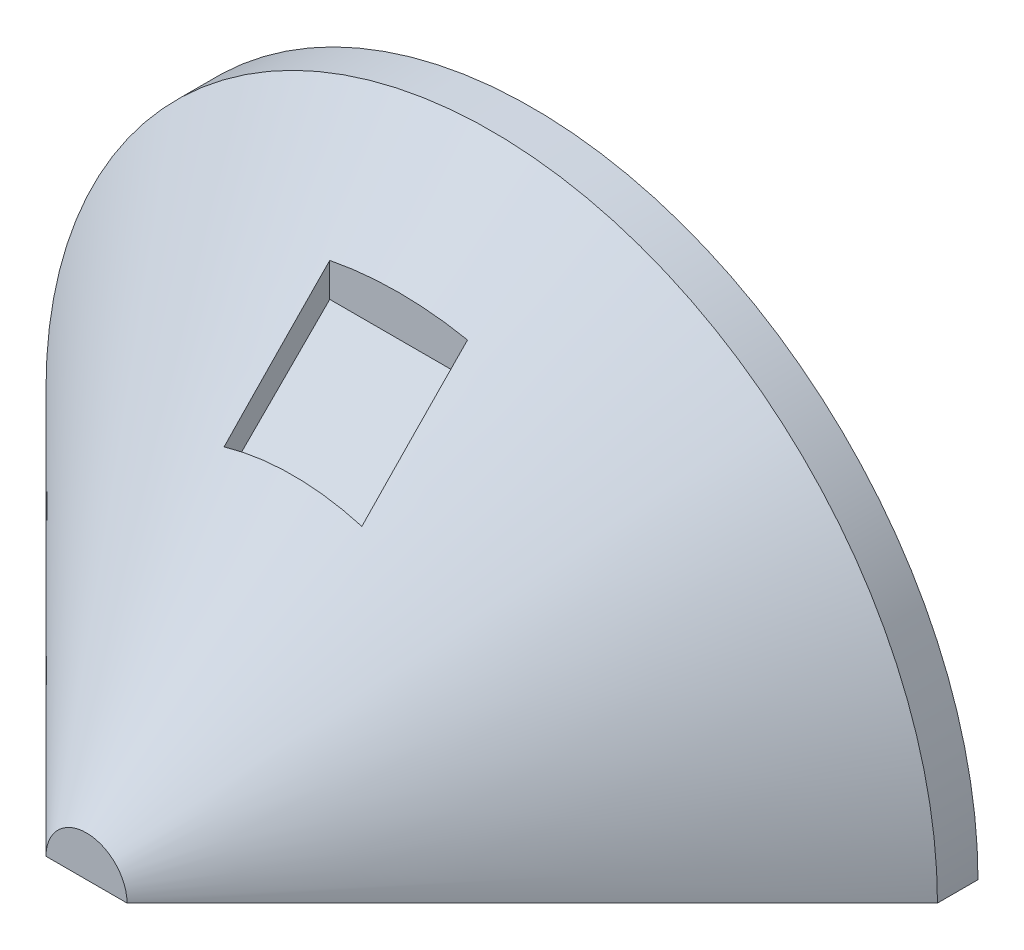
ISO-10303-21;
HEADER;
FILE_DESCRIPTION(('STEP AP214'),'2;1');
FILE_NAME('part.step','',(''),(''),'','','');
FILE_SCHEMA(('AUTOMOTIVE_DESIGN { 1 0 10303 214 1 1 1 1 }'));
ENDSEC;
DATA;
#1=APPLICATION_CONTEXT('core data for automotive mechanical design processes');
#2=APPLICATION_PROTOCOL_DEFINITION('international standard','automotive_design',2000,#1);
#3=PRODUCT_CONTEXT('',#1,'mechanical');
#4=PRODUCT('Part','Part','',(#3));
#5=PRODUCT_RELATED_PRODUCT_CATEGORY('part','',(#4));
#6=PRODUCT_DEFINITION_FORMATION('','',#4);
#7=PRODUCT_DEFINITION_CONTEXT('part definition',#1,'design');
#8=PRODUCT_DEFINITION('design','',#6,#7);
#9=PRODUCT_DEFINITION_SHAPE('','',#8);
#10=(LENGTH_UNIT() NAMED_UNIT(*) SI_UNIT(.MILLI.,.METRE.));
#11=(NAMED_UNIT(*) PLANE_ANGLE_UNIT() SI_UNIT($,.RADIAN.));
#12=(NAMED_UNIT(*) SI_UNIT($,.STERADIAN.) SOLID_ANGLE_UNIT());
#13=UNCERTAINTY_MEASURE_WITH_UNIT(LENGTH_MEASURE(1.E-05),#10,'distance_accuracy_value','');
#14=(GEOMETRIC_REPRESENTATION_CONTEXT(3) GLOBAL_UNCERTAINTY_ASSIGNED_CONTEXT((#13)) GLOBAL_UNIT_ASSIGNED_CONTEXT((#10,
#11,#12)) REPRESENTATION_CONTEXT('',''));
#15=CARTESIAN_POINT('',(0.,0.,0.));
#16=DIRECTION('',(0.,0.,1.));
#17=DIRECTION('',(1.,0.,0.));
#18=AXIS2_PLACEMENT_3D('',#15,#16,#17);
#19=CARTESIAN_POINT('',(0.,0.,0.));
#20=DIRECTION('',(0.,0.,1.));
#21=DIRECTION('',(1.,0.,0.));
#22=AXIS2_PLACEMENT_3D('',#19,#20,#21);
#23=PLANE('',#22);
#24=CARTESIAN_POINT('',(0.,0.,0.));
#25=DIRECTION('',(0.,0.,-1.));
#26=DIRECTION('',(-1.,0.,0.));
#27=AXIS2_PLACEMENT_3D('',#24,#25,#26);
#28=CIRCLE('',#27,3.81);
#29=CARTESIAN_POINT('',(-3.81,0.,0.));
#30=VERTEX_POINT('',#29);
#31=CARTESIAN_POINT('',(3.81,0.,0.));
#32=VERTEX_POINT('',#31);
#33=EDGE_CURVE('E70',#30,#32,#28,.T.);
#34=ORIENTED_EDGE('',*,*,#33,.F.);
#35=DIRECTION('',(1.,0.,0.));
#36=VECTOR('',#35,1.);
#37=CARTESIAN_POINT('',(0.,0.,0.));
#38=LINE('',#37,#36);
#39=EDGE_CURVE('E183',#30,#32,#38,.T.);
#40=ORIENTED_EDGE('',*,*,#39,.T.);
#41=EDGE_LOOP('',(#34,#40));
#42=FACE_BOUND('',#41,.T.);
#43=ADVANCED_FACE('F43',(#42),#23,.T.);
#44=CARTESIAN_POINT('',(0.,0.,-38.1));
#45=DIRECTION('',(0.,0.,-1.));
#46=DIRECTION('',(-1.,0.,0.));
#47=AXIS2_PLACEMENT_3D('',#44,#45,#46);
#48=CONICAL_SURFACE('',#47,41.91,0.785398163397448);
#49=CARTESIAN_POINT('',(6.477,-0.112424499922271,-2.66797563040976));
#50=CARTESIAN_POINT('',(6.477,-0.0315397783691941,-2.66656842659704));
#51=CARTESIAN_POINT('',(6.477,0.0493638171931178,-2.66668282075297));
#52=CARTESIAN_POINT('',(6.477,0.211105285739149,-2.66993557111974));
#53=CARTESIAN_POINT('',(6.477,0.291943162485806,-2.67307373989165));
#54=CARTESIAN_POINT('',(6.477,0.534021317714192,-2.68698377775918));
#55=CARTESIAN_POINT('',(6.477,0.695023658826708,-2.70224785264693));
#56=CARTESIAN_POINT('',(6.477,1.01277699998929,-2.74384155982011));
#57=CARTESIAN_POINT('',(6.477,1.16955373923047,-2.7699786290904));
#58=CARTESIAN_POINT('',(6.477,1.48109428375716,-2.83242852403535));
#59=CARTESIAN_POINT('',(6.477,1.63585744062297,-2.86874454665507));
#60=CARTESIAN_POINT('',(6.477,2.0743987666114,-2.98553121341364));
#61=CARTESIAN_POINT('',(6.477,2.35521836151851,-3.07718883395554));
#62=CARTESIAN_POINT('',(6.477,2.9076359645997,-3.28507676071129));
#63=CARTESIAN_POINT('',(6.477,3.17922539734786,-3.40132922986404));
#64=CARTESIAN_POINT('',(6.477,3.58156012766853,-3.59033228058236));
#65=CARTESIAN_POINT('',(6.477,3.71560732791135,-3.65620440562166));
#66=CARTESIAN_POINT('',(6.477,3.98159947791186,-3.79207713575769));
#67=CARTESIAN_POINT('',(6.477,4.11354439397102,-3.86207780694848));
#68=CARTESIAN_POINT('',(6.477,4.37541161385664,-4.00561053251651));
#69=CARTESIAN_POINT('',(6.477,4.50533482836017,-4.07914093214022));
#70=CARTESIAN_POINT('',(6.477,4.7633697993553,-4.22929280967487));
#71=CARTESIAN_POINT('',(6.477,4.89148163532004,-4.30591415140071));
#72=CARTESIAN_POINT('',(6.477,5.30848315030634,-4.56131561145365));
#73=CARTESIAN_POINT('',(6.477,5.59394527853482,-4.74570209717957));
#74=CARTESIAN_POINT('',(6.477,6.15801622443841,-5.12471571332597));
#75=CARTESIAN_POINT('',(6.477,6.43662328771391,-5.31934542607513));
#76=CARTESIAN_POINT('',(6.477,6.98850666908645,-5.7164909358629));
#77=CARTESIAN_POINT('',(6.477,7.26177814593219,-5.91901343690778));
#78=CARTESIAN_POINT('',(6.477,7.80377309754577,-6.3299812599359));
#79=CARTESIAN_POINT('',(6.477,8.07249698312132,-6.53842604232193));
#80=CARTESIAN_POINT('',(6.477,8.6070222328027,-6.96058144259871));
#81=CARTESIAN_POINT('',(6.477,8.87281297877217,-7.17430547202932));
#82=CARTESIAN_POINT('',(6.477,9.40134550956858,-7.60549328726715));
#83=CARTESIAN_POINT('',(6.477,9.66408723681773,-7.82295714350557));
#84=CARTESIAN_POINT('',(6.477,10.1869085577479,-8.26080099769757));
#85=CARTESIAN_POINT('',(6.477,10.4469893836969,-8.48117952635406));
#86=CARTESIAN_POINT('',(6.477,10.9650282174673,-8.92441964236062));
#87=CARTESIAN_POINT('',(6.477,11.2229862031139,-9.14728125559146));
#88=CARTESIAN_POINT('',(6.477,11.9959394192831,-9.82046305935856));
#89=CARTESIAN_POINT('',(6.477,12.5082363060682,-10.2738812395394));
#90=CARTESIAN_POINT('',(6.477,13.5276550554752,-11.1865890975303));
#91=CARTESIAN_POINT('',(6.477,14.0347763404682,-11.6458794180955));
#92=CARTESIAN_POINT('',(6.477,15.0441690034447,-12.5679261684386));
#93=CARTESIAN_POINT('',(6.477,15.5464475056236,-13.0306748075445));
#94=CARTESIAN_POINT('',(6.477,16.5479678081906,-13.9594047983083));
#95=CARTESIAN_POINT('',(6.477,17.0472097215484,-14.425386028307));
#96=CARTESIAN_POINT('',(6.477,18.2937231159675,-15.5947515567936));
#97=CARTESIAN_POINT('',(6.477,19.0395112530478,-16.2997163027392));
#98=CARTESIAN_POINT('',(6.477,20.5272829862537,-17.7136515933826));
#99=CARTESIAN_POINT('',(6.477,21.2692665589997,-18.4226221626405));
#100=CARTESIAN_POINT('',(6.477,22.7504248916093,-19.8435342618056));
#101=CARTESIAN_POINT('',(6.477,23.4895995660363,-20.5554758807211));
#102=CARTESIAN_POINT('',(6.477,24.9657941301942,-21.9815903637915));
#103=CARTESIAN_POINT('',(6.477,25.7028140168265,-22.695763231152));
#104=CARTESIAN_POINT('',(6.477,27.1757973057999,-24.1264414578815));
#105=CARTESIAN_POINT('',(6.477,27.9117592880827,-24.842948278796));
#106=CARTESIAN_POINT('',(6.477,29.3823462026258,-26.2773329597243));
#107=CARTESIAN_POINT('',(6.477,30.116971134271,-26.9952108203684));
#108=CARTESIAN_POINT('',(6.477,32.3192203678154,-29.1504601094189));
#109=CARTESIAN_POINT('',(6.477,33.7852417498964,-30.589469271821));
#110=CARTESIAN_POINT('',(6.477,36.6734260487644,-33.4301140399115));
#111=CARTESIAN_POINT('',(6.477,38.0956684775221,-34.8316688664826));
#112=CARTESIAN_POINT('',(6.477,40.9381992558085,-37.6367720278648));
#113=CARTESIAN_POINT('',(6.477,42.3584875959085,-39.040320372229));
#114=CARTESIAN_POINT('',(6.477,45.1962800034836,-41.8475518515579));
#115=CARTESIAN_POINT('',(6.477,46.6137854336088,-43.251233609422));
#116=CARTESIAN_POINT('',(6.477,49.4476698513075,-46.0597176261795));
#117=CARTESIAN_POINT('',(6.477,50.8640488452802,-47.4645198786154));
#118=CARTESIAN_POINT('',(6.477,52.2800304745773,-48.8697220514946));
#119=B_SPLINE_CURVE_WITH_KNOTS('',3,(#49,#50,#51,#52,#53,#54,#55,#56,#57,#58,#59,#60,#61,#62,
#63,#64,#65,#66,#67,#68,#69,#70,#71,#72,#73,#74,#75,#76,#77,#78,#79,#80,#81,#82,#83,#84,#85,#86,
#87,#88,#89,#90,#91,#92,#93,#94,#95,#96,#97,#98,#99,#100,#101,#102,#103,#104,#105,#106,#107,
#108,#109,#110,#111,#112,#113,#114,#115,#116,#117,#118),.UNSPECIFIED.,.F.,.F.,(4,2,2,2,2,2,2,2,
2,2,2,2,2,2,2,2,2,2,2,2,2,2,2,2,2,2,2,2,2,2,2,2,2,2,4),(0.,0.242661787159103,0.48530853307144,
0.970010831047795,1.44647163259076,1.92308224611174,2.80765362181052,3.6930255247552,
4.14104106147632,4.58906377244409,5.03687846124224,5.48467344108918,6.50383180494214,
7.52324834207755,8.54355047879481,9.56375994890728,10.5869013146027,11.6100619700024,
12.6327251442111,13.6553989874515,15.7077215114594,17.7602706361088,19.8090997120878,
21.8578520938967,24.9365585845551,28.0152839715619,31.0941022644535,34.1729249826392,
37.2543507480666,40.3357779305724,46.4985375309629,52.4888746624677,58.479240597486,
64.4639535509897,70.4486322598744),.UNSPECIFIED.);
#120=CARTESIAN_POINT('',(6.477,22.3014309146922,-19.4129487757862));
#121=VERTEX_POINT('',#120);
#122=CARTESIAN_POINT('',(6.477,32.5155241960894,-29.3443487757862));
#123=VERTEX_POINT('',#122);
#124=EDGE_CURVE('E11',#121,#123,#119,.T.);
#125=ORIENTED_EDGE('',*,*,#124,.F.);
#126=CARTESIAN_POINT('',(0.,0.,-19.4129487757862));
#127=DIRECTION('',(0.,0.,-1.));
#128=DIRECTION('',(0.,1.,0.));
#129=AXIS2_PLACEMENT_3D('',#126,#127,#128);
#130=CIRCLE('',#129,23.2229487757862);
#131=CARTESIAN_POINT('',(-6.477,22.3014309146922,-19.4129487757862));
#132=VERTEX_POINT('',#131);
#133=EDGE_CURVE('E205',#121,#132,#130,.F.);
#134=ORIENTED_EDGE('',*,*,#133,.T.);
#135=CARTESIAN_POINT('',(-6.477,-0.112424499922271,-2.66797563040976));
#136=CARTESIAN_POINT('',(-6.477,-0.0315397783691942,-2.66656842659705));
#137=CARTESIAN_POINT('',(-6.477,0.0493638171931179,-2.66668282075297));
#138=CARTESIAN_POINT('',(-6.477,0.211105285739149,-2.66993557111974));
#139=CARTESIAN_POINT('',(-6.477,0.291943162485806,-2.67307373989164));
#140=CARTESIAN_POINT('',(-6.477,0.534021317714192,-2.68698377775917));
#141=CARTESIAN_POINT('',(-6.477,0.695023658826709,-2.70224785264693));
#142=CARTESIAN_POINT('',(-6.477,1.01277699998929,-2.74384155982011));
#143=CARTESIAN_POINT('',(-6.477,1.16955373923047,-2.76997862909041));
#144=CARTESIAN_POINT('',(-6.477,1.48109428375716,-2.83242852403536));
#145=CARTESIAN_POINT('',(-6.477,1.63585744062297,-2.86874454665508));
#146=CARTESIAN_POINT('',(-6.477,2.0743987666114,-2.98553121341365));
#147=CARTESIAN_POINT('',(-6.477,2.35521836151851,-3.07718883395553));
#148=CARTESIAN_POINT('',(-6.477,2.9076359645997,-3.28507676071129));
#149=CARTESIAN_POINT('',(-6.477,3.17922539734786,-3.40132922986405));
#150=CARTESIAN_POINT('',(-6.477,3.58156012766853,-3.59033228058236));
#151=CARTESIAN_POINT('',(-6.477,3.71560732791135,-3.65620440562166));
#152=CARTESIAN_POINT('',(-6.477,3.98159947791186,-3.79207713575769));
#153=CARTESIAN_POINT('',(-6.477,4.11354439397102,-3.86207780694848));
#154=CARTESIAN_POINT('',(-6.477,4.37541161385664,-4.00561053251651));
#155=CARTESIAN_POINT('',(-6.477,4.50533482836017,-4.07914093214022));
#156=CARTESIAN_POINT('',(-6.477,4.7633697993553,-4.22929280967487));
#157=CARTESIAN_POINT('',(-6.477,4.89148163532004,-4.30591415140071));
#158=CARTESIAN_POINT('',(-6.477,5.30848315030634,-4.56131561145365));
#159=CARTESIAN_POINT('',(-6.477,5.59394527853482,-4.74570209717957));
#160=CARTESIAN_POINT('',(-6.477,6.15801622443841,-5.12471571332596));
#161=CARTESIAN_POINT('',(-6.477,6.43662328771391,-5.31934542607514));
#162=CARTESIAN_POINT('',(-6.477,6.98850666908645,-5.71649093586291));
#163=CARTESIAN_POINT('',(-6.477,7.26177814593219,-5.91901343690779));
#164=CARTESIAN_POINT('',(-6.477,7.80377309754577,-6.3299812599359));
#165=CARTESIAN_POINT('',(-6.477,8.07249698312133,-6.53842604232193));
#166=CARTESIAN_POINT('',(-6.477,8.60702223280271,-6.96058144259871));
#167=CARTESIAN_POINT('',(-6.477,8.87281297877218,-7.17430547202931));
#168=CARTESIAN_POINT('',(-6.477,9.40134550956859,-7.60549328726715));
#169=CARTESIAN_POINT('',(-6.477,9.66408723681773,-7.82295714350557));
#170=CARTESIAN_POINT('',(-6.477,10.1869085577479,-8.26080099769757));
#171=CARTESIAN_POINT('',(-6.477,10.4469893836969,-8.48117952635406));
#172=CARTESIAN_POINT('',(-6.477,10.9650282174673,-8.92441964236062));
#173=CARTESIAN_POINT('',(-6.477,11.2229862031139,-9.14728125559146));
#174=CARTESIAN_POINT('',(-6.477,11.9959394192831,-9.82046305935856));
#175=CARTESIAN_POINT('',(-6.477,12.5082363060682,-10.2738812395394));
#176=CARTESIAN_POINT('',(-6.477,13.5276550554752,-11.1865890975303));
#177=CARTESIAN_POINT('',(-6.477,14.0347763404682,-11.6458794180955));
#178=CARTESIAN_POINT('',(-6.477,15.0441690034447,-12.5679261684386));
#179=CARTESIAN_POINT('',(-6.477,15.5464475056236,-13.0306748075445));
#180=CARTESIAN_POINT('',(-6.477,16.5479678081906,-13.9594047983083));
#181=CARTESIAN_POINT('',(-6.477,17.0472097215484,-14.425386028307));
#182=CARTESIAN_POINT('',(-6.477,18.2937231159675,-15.5947515567936));
#183=CARTESIAN_POINT('',(-6.477,19.0395112530478,-16.2997163027392));
#184=CARTESIAN_POINT('',(-6.477,20.5272829862537,-17.7136515933826));
#185=CARTESIAN_POINT('',(-6.477,21.2692665589998,-18.4226221626405));
#186=CARTESIAN_POINT('',(-6.477,22.7504248916093,-19.8435342618056));
#187=CARTESIAN_POINT('',(-6.477,23.4895995660363,-20.5554758807211));
#188=CARTESIAN_POINT('',(-6.477,24.9657941301942,-21.9815903637915));
#189=CARTESIAN_POINT('',(-6.477,25.7028140168265,-22.695763231152));
#190=CARTESIAN_POINT('',(-6.477,27.1757973057999,-24.1264414578815));
#191=CARTESIAN_POINT('',(-6.477,27.9117592880827,-24.842948278796));
#192=CARTESIAN_POINT('',(-6.477,29.3823462026258,-26.2773329597243));
#193=CARTESIAN_POINT('',(-6.477,30.116971134271,-26.9952108203684));
#194=CARTESIAN_POINT('',(-6.477,32.3192203678154,-29.1504601094189));
#195=CARTESIAN_POINT('',(-6.477,33.7852417498964,-30.589469271821));
#196=CARTESIAN_POINT('',(-6.477,36.6734260487644,-33.4301140399115));
#197=CARTESIAN_POINT('',(-6.477,38.0956684775221,-34.8316688664826));
#198=CARTESIAN_POINT('',(-6.477,40.9381992558086,-37.6367720278648));
#199=CARTESIAN_POINT('',(-6.477,42.3584875959085,-39.040320372229));
#200=CARTESIAN_POINT('',(-6.477,45.1962800034836,-41.8475518515579));
#201=CARTESIAN_POINT('',(-6.477,46.6137854336088,-43.251233609422));
#202=CARTESIAN_POINT('',(-6.477,49.4476698513075,-46.0597176261795));
#203=CARTESIAN_POINT('',(-6.477,50.8640488452802,-47.4645198786154));
#204=CARTESIAN_POINT('',(-6.477,52.2800304745773,-48.8697220514946));
#205=B_SPLINE_CURVE_WITH_KNOTS('',3,(#135,#136,#137,#138,#139,#140,#141,#142,#143,#144,#145,
#146,#147,#148,#149,#150,#151,#152,#153,#154,#155,#156,#157,#158,#159,#160,#161,#162,#163,#164,
#165,#166,#167,#168,#169,#170,#171,#172,#173,#174,#175,#176,#177,#178,#179,#180,#181,#182,#183,
#184,#185,#186,#187,#188,#189,#190,#191,#192,#193,#194,#195,#196,#197,#198,#199,#200,#201,#202,
#203,#204),.UNSPECIFIED.,.F.,.F.,(4,2,2,2,2,2,2,2,2,2,2,2,2,2,2,2,2,2,2,2,2,2,2,2,2,2,2,2,2,2,2,
2,2,2,4),(0.,0.242661787159103,0.48530853307144,0.970010831047796,1.44647163259076,
1.92308224611174,2.80765362181052,3.6930255247552,4.14104106147632,4.58906377244409,
5.03687846124224,5.48467344108918,6.50383180494214,7.52324834207756,8.54355047879481,
9.56375994890728,10.5869013146027,11.6100619700024,12.6327251442111,13.6553989874515,
15.7077215114594,17.7602706361088,19.8090997120878,21.8578520938967,24.9365585845551,
28.015283971562,31.0941022644535,34.1729249826392,37.2543507480666,40.3357779305724,
46.4985375309629,52.4888746624677,58.479240597486,64.4639535509896,70.4486322598744),.UNSPECIFIED.);
#206=CARTESIAN_POINT('',(-6.477,32.5155241960894,-29.3443487757862));
#207=VERTEX_POINT('',#206);
#208=EDGE_CURVE('E197',#132,#207,#205,.T.);
#209=ORIENTED_EDGE('',*,*,#208,.T.);
#210=CARTESIAN_POINT('',(0.,0.,-29.3443487757862));
#211=DIRECTION('',(0.,0.,1.));
#212=DIRECTION('',(1.,0.,0.));
#213=AXIS2_PLACEMENT_3D('',#210,#211,#212);
#214=CIRCLE('',#213,33.1543487757862);
#215=EDGE_CURVE('E56',#207,#123,#214,.F.);
#216=ORIENTED_EDGE('',*,*,#215,.T.);
#217=EDGE_LOOP('',(#125,#134,#209,#216));
#218=FACE_BOUND('',#217,.T.);
#219=CARTESIAN_POINT('',(0.,0.,-38.1));
#220=DIRECTION('',(0.,0.,-1.));
#221=DIRECTION('',(-1.,0.,0.));
#222=AXIS2_PLACEMENT_3D('',#219,#220,#221);
#223=CIRCLE('',#222,41.91);
#224=CARTESIAN_POINT('',(-41.91,-1.46327982910916E-13,-38.1));
#225=VERTEX_POINT('',#224);
#226=CARTESIAN_POINT('',(41.91,-1.46327982910916E-13,-38.1));
#227=VERTEX_POINT('',#226);
#228=EDGE_CURVE('E192',#225,#227,#223,.T.);
#229=ORIENTED_EDGE('',*,*,#228,.F.);
#230=DIRECTION('',(0.707106781186547,0.,0.707106781186547));
#231=VECTOR('',#230,1.);
#232=CARTESIAN_POINT('',(-41.91,-1.46327982910916E-13,-38.1));
#233=LINE('',#232,#231);
#234=EDGE_CURVE('E180',#225,#30,#233,.T.);
#235=ORIENTED_EDGE('',*,*,#234,.T.);
#236=ORIENTED_EDGE('',*,*,#33,.T.);
#237=DIRECTION('',(-0.707106781186547,0.,0.707106781186547));
#238=VECTOR('',#237,1.);
#239=CARTESIAN_POINT('',(41.91,-1.46327982910916E-13,-38.1));
#240=LINE('',#239,#238);
#241=EDGE_CURVE('E164',#227,#32,#240,.T.);
#242=ORIENTED_EDGE('',*,*,#241,.F.);
#243=EDGE_LOOP('',(#229,#235,#236,#242));
#244=FACE_BOUND('',#243,.T.);
#245=ADVANCED_FACE('F206',(#218,#244),#48,.T.);
#246=CARTESIAN_POINT('',(0.,0.,-3.81));
#247=DIRECTION('',(0.,0.,-1.));
#248=DIRECTION('',(-1.,0.,0.));
#249=AXIS2_PLACEMENT_3D('',#246,#247,#248);
#250=CYLINDRICAL_SURFACE('',#249,41.91);
#251=CARTESIAN_POINT('',(0.,0.,-41.91));
#252=DIRECTION('',(0.,0.,-1.));
#253=DIRECTION('',(-1.,0.,0.));
#254=AXIS2_PLACEMENT_3D('',#251,#252,#253);
#255=CIRCLE('',#254,41.91);
#256=CARTESIAN_POINT('',(-41.91,-1.46327982910916E-13,-41.91));
#257=VERTEX_POINT('',#256);
#258=CARTESIAN_POINT('',(41.91,-1.46327982910916E-13,-41.91));
#259=VERTEX_POINT('',#258);
#260=EDGE_CURVE('E189',#257,#259,#255,.T.);
#261=ORIENTED_EDGE('',*,*,#260,.F.);
#262=DIRECTION('',(0.,0.,1.));
#263=VECTOR('',#262,1.);
#264=CARTESIAN_POINT('',(-41.91,-1.46327982910916E-13,-38.1));
#265=LINE('',#264,#263);
#266=EDGE_CURVE('E176',#257,#225,#265,.T.);
#267=ORIENTED_EDGE('',*,*,#266,.T.);
#268=ORIENTED_EDGE('',*,*,#228,.T.);
#269=DIRECTION('',(0.,0.,1.));
#270=VECTOR('',#269,1.);
#271=CARTESIAN_POINT('',(41.91,-1.46327982910916E-13,-38.1));
#272=LINE('',#271,#270);
#273=EDGE_CURVE('E160',#259,#227,#272,.T.);
#274=ORIENTED_EDGE('',*,*,#273,.F.);
#275=EDGE_LOOP('',(#261,#267,#268,#274));
#276=FACE_BOUND('',#275,.T.);
#277=ADVANCED_FACE('F234',(#276),#250,.T.);
#278=CARTESIAN_POINT('',(-41.91,-1.46327982910916E-13,-41.91));
#279=DIRECTION('',(0.,0.,-1.));
#280=DIRECTION('',(-1.,0.,0.));
#281=AXIS2_PLACEMENT_3D('',#278,#279,#280);
#282=PLANE('',#281);
#283=CARTESIAN_POINT('',(0.,0.,-41.91));
#284=DIRECTION('',(0.,0.,-1.));
#285=DIRECTION('',(-1.,0.,0.));
#286=AXIS2_PLACEMENT_3D('',#283,#284,#285);
#287=CIRCLE('',#286,38.1);
#288=CARTESIAN_POINT('',(-38.1,-1.33025439009923E-13,-41.91));
#289=VERTEX_POINT('',#288);
#290=CARTESIAN_POINT('',(38.1,-1.33025439009923E-13,-41.91));
#291=VERTEX_POINT('',#290);
#292=EDGE_CURVE('E186',#289,#291,#287,.T.);
#293=ORIENTED_EDGE('',*,*,#292,.F.);
#294=DIRECTION('',(-1.,0.,0.));
#295=VECTOR('',#294,1.);
#296=CARTESIAN_POINT('',(-41.91,-1.46327982910916E-13,-41.91));
#297=LINE('',#296,#295);
#298=EDGE_CURVE('E172',#289,#257,#297,.T.);
#299=ORIENTED_EDGE('',*,*,#298,.T.);
#300=ORIENTED_EDGE('',*,*,#260,.T.);
#301=DIRECTION('',(1.,0.,0.));
#302=VECTOR('',#301,1.);
#303=CARTESIAN_POINT('',(41.91,-1.46327982910916E-13,-41.91));
#304=LINE('',#303,#302);
#305=EDGE_CURVE('E156',#291,#259,#304,.T.);
#306=ORIENTED_EDGE('',*,*,#305,.F.);
#307=EDGE_LOOP('',(#293,#299,#300,#306));
#308=FACE_BOUND('',#307,.T.);
#309=ADVANCED_FACE('F231',(#308),#282,.T.);
#310=CARTESIAN_POINT('',(0.,0.,-3.81));
#311=DIRECTION('',(0.,0.,-1.));
#312=DIRECTION('',(-1.,0.,0.));
#313=AXIS2_PLACEMENT_3D('',#310,#311,#312);
#314=CONICAL_SURFACE('',#313,0.,0.785398163397448);
#315=DIRECTION('',(-0.707106781186547,0.,-0.707106781186547));
#316=VECTOR('',#315,1.);
#317=CARTESIAN_POINT('',(-38.1,-1.33025439009923E-13,-41.91));
#318=LINE('',#317,#316);
#319=CARTESIAN_POINT('',(0.,0.,-3.81));
#320=VERTEX_POINT('',#319);
#321=EDGE_CURVE('E168',#320,#289,#318,.T.);
#322=ORIENTED_EDGE('',*,*,#321,.T.);
#323=ORIENTED_EDGE('',*,*,#292,.T.);
#324=DIRECTION('',(0.707106781186547,0.,-0.707106781186547));
#325=VECTOR('',#324,1.);
#326=CARTESIAN_POINT('',(38.1,-1.33025439009923E-13,-41.91));
#327=LINE('',#326,#325);
#328=EDGE_CURVE('E126',#320,#291,#327,.T.);
#329=ORIENTED_EDGE('',*,*,#328,.F.);
#330=EDGE_LOOP('',(#322,#323,#329));
#331=FACE_BOUND('',#330,.T.);
#332=ADVANCED_FACE('F227',(#331),#314,.F.);
#333=CARTESIAN_POINT('',(0.,0.,0.));
#334=DIRECTION('',(0.,-1.,0.));
#335=DIRECTION('',(0.,0.,1.));
#336=AXIS2_PLACEMENT_3D('',#333,#334,#335);
#337=PLANE('',#336);
#338=ORIENTED_EDGE('',*,*,#321,.F.);
#339=ORIENTED_EDGE('',*,*,#328,.T.);
#340=ORIENTED_EDGE('',*,*,#305,.T.);
#341=ORIENTED_EDGE('',*,*,#273,.T.);
#342=ORIENTED_EDGE('',*,*,#241,.T.);
#343=ORIENTED_EDGE('',*,*,#39,.F.);
#344=ORIENTED_EDGE('',*,*,#234,.F.);
#345=ORIENTED_EDGE('',*,*,#266,.F.);
#346=ORIENTED_EDGE('',*,*,#298,.F.);
#347=EDGE_LOOP('',(#338,#339,#340,#341,#342,#343,#344,#345,#346));
#348=FACE_BOUND('',#347,.T.);
#349=ADVANCED_FACE('F224',(#348),#337,.T.);
#350=CARTESIAN_POINT('',(6.477,19.4129487757861,-19.4129487757862));
#351=DIRECTION('',(0.,0.707106781186548,0.707106781186547));
#352=DIRECTION('',(0.,-0.707106781186547,0.707106781186548));
#353=AXIS2_PLACEMENT_3D('',#350,#351,#352);
#354=PLANE('',#353);
#355=DIRECTION('',(-1.,0.,0.));
#356=VECTOR('',#355,1.);
#357=CARTESIAN_POINT('',(6.477,19.4129487757861,-19.4129487757862));
#358=LINE('',#357,#356);
#359=CARTESIAN_POINT('',(6.477,19.4129487757861,-19.4129487757862));
#360=VERTEX_POINT('',#359);
#361=CARTESIAN_POINT('',(-6.477,19.4129487757861,-19.4129487757862));
#362=VERTEX_POINT('',#361);
#363=EDGE_CURVE('E127',#360,#362,#358,.T.);
#364=ORIENTED_EDGE('',*,*,#363,.F.);
#365=DIRECTION('',(0.,0.707106781186547,-0.707106781186548));
#366=VECTOR('',#365,1.);
#367=CARTESIAN_POINT('',(6.477,19.4129487757861,-19.4129487757862));
#368=LINE('',#367,#366);
#369=CARTESIAN_POINT('',(6.477,29.3443487757861,-29.3443487757862));
#370=VERTEX_POINT('',#369);
#371=EDGE_CURVE('E122',#360,#370,#368,.T.);
#372=ORIENTED_EDGE('',*,*,#371,.T.);
#373=DIRECTION('',(-1.,0.,0.));
#374=VECTOR('',#373,1.);
#375=CARTESIAN_POINT('',(6.477,29.3443487757861,-29.3443487757862));
#376=LINE('',#375,#374);
#377=CARTESIAN_POINT('',(-6.477,29.3443487757861,-29.3443487757862));
#378=VERTEX_POINT('',#377);
#379=EDGE_CURVE('E117',#370,#378,#376,.T.);
#380=ORIENTED_EDGE('',*,*,#379,.T.);
#381=DIRECTION('',(0.,0.707106781186547,-0.707106781186548));
#382=VECTOR('',#381,1.);
#383=CARTESIAN_POINT('',(-6.477,19.4129487757861,-19.4129487757862));
#384=LINE('',#383,#382);
#385=EDGE_CURVE('E120',#362,#378,#384,.T.);
#386=ORIENTED_EDGE('',*,*,#385,.F.);
#387=EDGE_LOOP('',(#364,#372,#380,#386));
#388=FACE_BOUND('',#387,.T.);
#389=ADVANCED_FACE('F119',(#388),#354,.T.);
#390=CARTESIAN_POINT('',(6.477,29.3443487757861,-29.3443487757862));
#391=DIRECTION('',(0.,0.,1.));
#392=DIRECTION('',(1.,0.,0.));
#393=AXIS2_PLACEMENT_3D('',#390,#391,#392);
#394=PLANE('',#393);
#395=DIRECTION('',(0.,1.,0.));
#396=VECTOR('',#395,1.);
#397=CARTESIAN_POINT('',(-6.477,29.3443487757861,-29.3443487757862));
#398=LINE('',#397,#396);
#399=EDGE_CURVE('E63',#378,#207,#398,.T.);
#400=ORIENTED_EDGE('',*,*,#399,.F.);
#401=ORIENTED_EDGE('',*,*,#379,.F.);
#402=DIRECTION('',(0.,1.,0.));
#403=VECTOR('',#402,1.);
#404=CARTESIAN_POINT('',(6.477,29.3443487757861,-29.3443487757862));
#405=LINE('',#404,#403);
#406=EDGE_CURVE('E145',#370,#123,#405,.T.);
#407=ORIENTED_EDGE('',*,*,#406,.T.);
#408=ORIENTED_EDGE('',*,*,#215,.F.);
#409=EDGE_LOOP('',(#400,#401,#407,#408));
#410=FACE_BOUND('',#409,.T.);
#411=ADVANCED_FACE('F129',(#410),#394,.T.);
#412=CARTESIAN_POINT('',(6.477,19.4129487757861,-19.4129487757862));
#413=DIRECTION('',(0.,0.,-1.));
#414=DIRECTION('',(0.,1.,0.));
#415=AXIS2_PLACEMENT_3D('',#412,#413,#414);
#416=PLANE('',#415);
#417=DIRECTION('',(0.,-1.,0.));
#418=VECTOR('',#417,1.);
#419=CARTESIAN_POINT('',(6.477,29.3189487757862,-19.4129487757862));
#420=LINE('',#419,#418);
#421=EDGE_CURVE('E148',#121,#360,#420,.T.);
#422=ORIENTED_EDGE('',*,*,#421,.T.);
#423=ORIENTED_EDGE('',*,*,#363,.T.);
#424=DIRECTION('',(0.,-1.,0.));
#425=VECTOR('',#424,1.);
#426=CARTESIAN_POINT('',(-6.477,29.3189487757862,-19.4129487757862));
#427=LINE('',#426,#425);
#428=EDGE_CURVE('E133',#132,#362,#427,.T.);
#429=ORIENTED_EDGE('',*,*,#428,.F.);
#430=ORIENTED_EDGE('',*,*,#133,.F.);
#431=EDGE_LOOP('',(#422,#423,#429,#430));
#432=FACE_BOUND('',#431,.T.);
#433=ADVANCED_FACE('F215',(#432),#416,.T.);
#434=CARTESIAN_POINT('',(6.477,0.,0.));
#435=DIRECTION('',(1.,0.,0.));
#436=DIRECTION('',(0.,0.,-1.));
#437=AXIS2_PLACEMENT_3D('',#434,#435,#436);
#438=PLANE('',#437);
#439=ORIENTED_EDGE('',*,*,#124,.T.);
#440=ORIENTED_EDGE('',*,*,#406,.F.);
#441=ORIENTED_EDGE('',*,*,#371,.F.);
#442=ORIENTED_EDGE('',*,*,#421,.F.);
#443=EDGE_LOOP('',(#439,#440,#441,#442));
#444=FACE_BOUND('',#443,.T.);
#445=ADVANCED_FACE('F211',(#444),#438,.F.);
#446=CARTESIAN_POINT('',(-6.477,0.,0.));
#447=DIRECTION('',(1.,0.,0.));
#448=DIRECTION('',(0.,0.,-1.));
#449=AXIS2_PLACEMENT_3D('',#446,#447,#448);
#450=PLANE('',#449);
#451=ORIENTED_EDGE('',*,*,#428,.T.);
#452=ORIENTED_EDGE('',*,*,#385,.T.);
#453=ORIENTED_EDGE('',*,*,#399,.T.);
#454=ORIENTED_EDGE('',*,*,#208,.F.);
#455=EDGE_LOOP('',(#451,#452,#453,#454));
#456=FACE_BOUND('',#455,.T.);
#457=ADVANCED_FACE('F135',(#456),#450,.T.);
#458=CLOSED_SHELL('',(#43,#245,#277,#309,#332,#349,#389,#411,#433,#445,#457));
#459=MANIFOLD_SOLID_BREP('B2',#458);
#460=ADVANCED_BREP_SHAPE_REPRESENTATION('',(#18,#459),#14);
#461=SHAPE_DEFINITION_REPRESENTATION(#9,#460);
ENDSEC;
END-ISO-10303-21;
